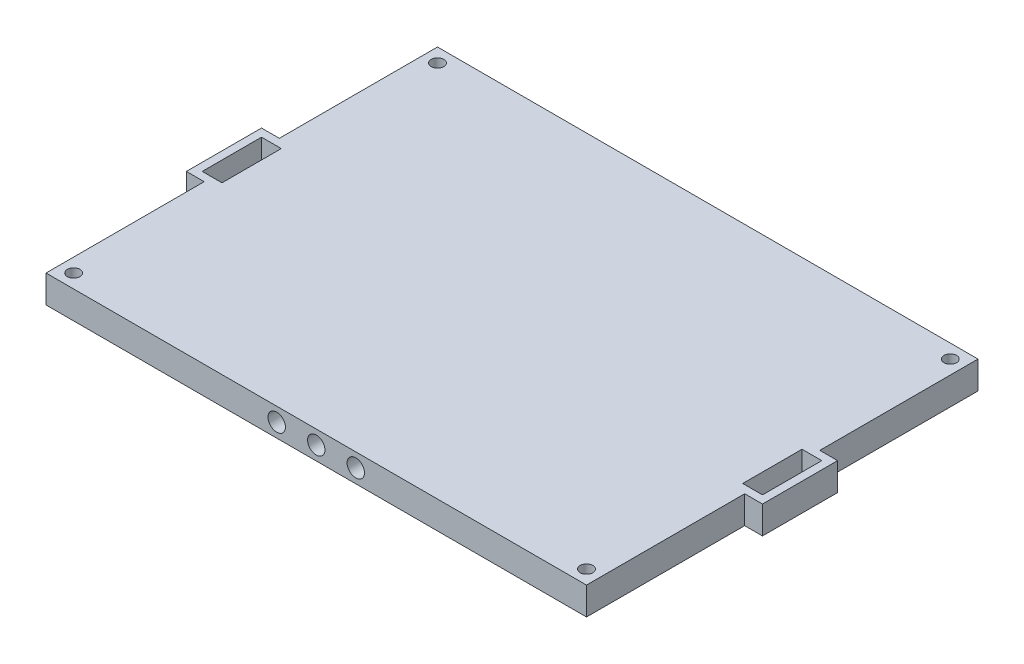
ISO-10303-21;
HEADER;
FILE_DESCRIPTION(('STEP AP214'),'2;1');
FILE_NAME('part.step','',(''),(''),'','','');
FILE_SCHEMA(('AUTOMOTIVE_DESIGN { 1 0 10303 214 1 1 1 1 }'));
ENDSEC;
DATA;
#1=APPLICATION_CONTEXT('core data for automotive mechanical design processes');
#2=APPLICATION_PROTOCOL_DEFINITION('international standard','automotive_design',2000,#1);
#3=PRODUCT_CONTEXT('',#1,'mechanical');
#4=PRODUCT('Part','Part','',(#3));
#5=PRODUCT_RELATED_PRODUCT_CATEGORY('part','',(#4));
#6=PRODUCT_DEFINITION_FORMATION('','',#4);
#7=PRODUCT_DEFINITION_CONTEXT('part definition',#1,'design');
#8=PRODUCT_DEFINITION('design','',#6,#7);
#9=PRODUCT_DEFINITION_SHAPE('','',#8);
#10=(LENGTH_UNIT() NAMED_UNIT(*) SI_UNIT(.MILLI.,.METRE.));
#11=(NAMED_UNIT(*) PLANE_ANGLE_UNIT() SI_UNIT($,.RADIAN.));
#12=(NAMED_UNIT(*) SI_UNIT($,.STERADIAN.) SOLID_ANGLE_UNIT());
#13=UNCERTAINTY_MEASURE_WITH_UNIT(LENGTH_MEASURE(1.E-05),#10,'distance_accuracy_value','');
#14=(GEOMETRIC_REPRESENTATION_CONTEXT(3) GLOBAL_UNCERTAINTY_ASSIGNED_CONTEXT((#13)) GLOBAL_UNIT_ASSIGNED_CONTEXT((#10,
#11,#12)) REPRESENTATION_CONTEXT('',''));
#15=CARTESIAN_POINT('',(0.,0.,0.));
#16=DIRECTION('',(0.,0.,1.));
#17=DIRECTION('',(1.,0.,0.));
#18=AXIS2_PLACEMENT_3D('',#15,#16,#17);
#19=CARTESIAN_POINT('',(0.,0.,0.));
#20=DIRECTION('',(0.,1.,0.));
#21=DIRECTION('',(0.,0.,1.));
#22=AXIS2_PLACEMENT_3D('',#19,#20,#21);
#23=PLANE('',#22);
#24=CARTESIAN_POINT('',(37.5,0.,-37.5));
#25=DIRECTION('',(0.,1.,0.));
#26=DIRECTION('',(0.,0.,1.));
#27=AXIS2_PLACEMENT_3D('',#24,#25,#26);
#28=CIRCLE('',#27,2.2);
#29=CARTESIAN_POINT('',(37.5,0.,-35.3));
#30=VERTEX_POINT('',#29);
#31=EDGE_CURVE('E526',#30,#30,#28,.F.);
#32=ORIENTED_EDGE('',*,*,#31,.F.);
#33=EDGE_LOOP('',(#32));
#34=FACE_BOUND('',#33,.T.);
#35=CARTESIAN_POINT('',(-37.5,0.,-37.5));
#36=DIRECTION('',(0.,1.,0.));
#37=DIRECTION('',(0.,0.,1.));
#38=AXIS2_PLACEMENT_3D('',#35,#36,#37);
#39=CIRCLE('',#38,2.2);
#40=CARTESIAN_POINT('',(-37.5,0.,-35.3));
#41=VERTEX_POINT('',#40);
#42=EDGE_CURVE('E525',#41,#41,#39,.T.);
#43=ORIENTED_EDGE('',*,*,#42,.T.);
#44=EDGE_LOOP('',(#43));
#45=FACE_BOUND('',#44,.T.);
#46=CARTESIAN_POINT('',(-64.8420173831868,0.,46.));
#47=DIRECTION('',(0.,1.,0.));
#48=DIRECTION('',(0.,0.,1.));
#49=AXIS2_PLACEMENT_3D('',#46,#47,#48);
#50=CIRCLE('',#49,1.60000000000001);
#51=CARTESIAN_POINT('',(-64.8420173831868,0.,47.6));
#52=VERTEX_POINT('',#51);
#53=EDGE_CURVE('E546',#52,#52,#50,.F.);
#54=ORIENTED_EDGE('',*,*,#53,.F.);
#55=EDGE_LOOP('',(#54));
#56=FACE_BOUND('',#55,.T.);
#57=CARTESIAN_POINT('',(-64.8420173831868,0.,-46.));
#58=DIRECTION('',(0.,1.,0.));
#59=DIRECTION('',(0.,0.,1.));
#60=AXIS2_PLACEMENT_3D('',#57,#58,#59);
#61=CIRCLE('',#60,1.60000000000001);
#62=CARTESIAN_POINT('',(-64.8420173831868,0.,-44.4));
#63=VERTEX_POINT('',#62);
#64=EDGE_CURVE('E312',#63,#63,#61,.T.);
#65=ORIENTED_EDGE('',*,*,#64,.T.);
#66=EDGE_LOOP('',(#65));
#67=FACE_BOUND('',#66,.T.);
#68=DIRECTION('',(1.,0.,0.));
#69=VECTOR('',#68,1.);
#70=CARTESIAN_POINT('',(0.,0.,7.5));
#71=LINE('',#70,#69);
#72=CARTESIAN_POINT('',(-70.8420173831867,0.,7.5));
#73=VERTEX_POINT('',#72);
#74=CARTESIAN_POINT('',(-65.8420173831867,0.,7.5));
#75=VERTEX_POINT('',#74);
#76=EDGE_CURVE('E305',#73,#75,#71,.T.);
#77=ORIENTED_EDGE('',*,*,#76,.T.);
#78=DIRECTION('',(0.,0.,-1.));
#79=VECTOR('',#78,1.);
#80=CARTESIAN_POINT('',(-65.8420173831867,0.,0.));
#81=LINE('',#80,#79);
#82=CARTESIAN_POINT('',(-65.8420173831867,0.,-7.5));
#83=VERTEX_POINT('',#82);
#84=EDGE_CURVE('E317',#75,#83,#81,.T.);
#85=ORIENTED_EDGE('',*,*,#84,.T.);
#86=DIRECTION('',(1.,0.,0.));
#87=VECTOR('',#86,1.);
#88=CARTESIAN_POINT('',(0.,0.,-7.5));
#89=LINE('',#88,#87);
#90=CARTESIAN_POINT('',(-70.8420173831867,0.,-7.5));
#91=VERTEX_POINT('',#90);
#92=EDGE_CURVE('E307',#91,#83,#89,.T.);
#93=ORIENTED_EDGE('',*,*,#92,.F.);
#94=DIRECTION('',(0.,0.,-1.));
#95=VECTOR('',#94,1.);
#96=CARTESIAN_POINT('',(-70.8420173831867,0.,0.));
#97=LINE('',#96,#95);
#98=EDGE_CURVE('E298',#73,#91,#97,.T.);
#99=ORIENTED_EDGE('',*,*,#98,.F.);
#100=EDGE_LOOP('',(#77,#85,#93,#99));
#101=FACE_BOUND('',#100,.T.);
#102=DIRECTION('',(0.,0.,-1.));
#103=VECTOR('',#102,1.);
#104=CARTESIAN_POINT('',(70.8420173831868,0.,0.));
#105=LINE('',#104,#103);
#106=CARTESIAN_POINT('',(70.8420173831868,0.,7.5));
#107=VERTEX_POINT('',#106);
#108=CARTESIAN_POINT('',(70.8420173831868,0.,-7.5));
#109=VERTEX_POINT('',#108);
#110=EDGE_CURVE('E319',#107,#109,#105,.T.);
#111=ORIENTED_EDGE('',*,*,#110,.T.);
#112=DIRECTION('',(-1.,0.,0.));
#113=VECTOR('',#112,1.);
#114=CARTESIAN_POINT('',(0.,0.,-7.5));
#115=LINE('',#114,#113);
#116=CARTESIAN_POINT('',(65.8420173831868,0.,-7.5));
#117=VERTEX_POINT('',#116);
#118=EDGE_CURVE('E328',#109,#117,#115,.T.);
#119=ORIENTED_EDGE('',*,*,#118,.T.);
#120=DIRECTION('',(0.,0.,-1.));
#121=VECTOR('',#120,1.);
#122=CARTESIAN_POINT('',(65.8420173831868,0.,0.));
#123=LINE('',#122,#121);
#124=CARTESIAN_POINT('',(65.8420173831868,0.,7.5));
#125=VERTEX_POINT('',#124);
#126=EDGE_CURVE('E325',#125,#117,#123,.T.);
#127=ORIENTED_EDGE('',*,*,#126,.F.);
#128=DIRECTION('',(-1.,0.,0.));
#129=VECTOR('',#128,1.);
#130=CARTESIAN_POINT('',(0.,0.,7.5));
#131=LINE('',#130,#129);
#132=EDGE_CURVE('E322',#107,#125,#131,.T.);
#133=ORIENTED_EDGE('',*,*,#132,.F.);
#134=EDGE_LOOP('',(#111,#119,#127,#133));
#135=FACE_BOUND('',#134,.T.);
#136=DIRECTION('',(0.,0.,-1.));
#137=VECTOR('',#136,1.);
#138=CARTESIAN_POINT('',(-68.3420173831867,0.,0.));
#139=LINE('',#138,#137);
#140=CARTESIAN_POINT('',(-68.3420173831867,0.,-9.5));
#141=VERTEX_POINT('',#140);
#142=CARTESIAN_POINT('',(-68.3420173831867,0.,-49.5));
#143=VERTEX_POINT('',#142);
#144=EDGE_CURVE('E331',#141,#143,#139,.T.);
#145=ORIENTED_EDGE('',*,*,#144,.T.);
#146=DIRECTION('',(1.,0.,0.));
#147=VECTOR('',#146,1.);
#148=CARTESIAN_POINT('',(0.,0.,-49.5));
#149=LINE('',#148,#147);
#150=CARTESIAN_POINT('',(68.3420173831868,0.,-49.5));
#151=VERTEX_POINT('',#150);
#152=EDGE_CURVE('E357',#143,#151,#149,.T.);
#153=ORIENTED_EDGE('',*,*,#152,.T.);
#154=DIRECTION('',(0.,0.,-1.));
#155=VECTOR('',#154,1.);
#156=CARTESIAN_POINT('',(68.3420173831868,0.,0.));
#157=LINE('',#156,#155);
#158=CARTESIAN_POINT('',(68.3420173831868,0.,-9.5));
#159=VERTEX_POINT('',#158);
#160=EDGE_CURVE('E350',#159,#151,#157,.T.);
#161=ORIENTED_EDGE('',*,*,#160,.F.);
#162=DIRECTION('',(-1.,0.,0.));
#163=VECTOR('',#162,1.);
#164=CARTESIAN_POINT('',(0.,0.,-9.50000000000001));
#165=LINE('',#164,#163);
#166=CARTESIAN_POINT('',(72.8420173831868,0.,-9.5));
#167=VERTEX_POINT('',#166);
#168=EDGE_CURVE('E255',#167,#159,#165,.T.);
#169=ORIENTED_EDGE('',*,*,#168,.F.);
#170=DIRECTION('',(0.,0.,-1.));
#171=VECTOR('',#170,1.);
#172=CARTESIAN_POINT('',(72.8420173831868,0.,0.));
#173=LINE('',#172,#171);
#174=CARTESIAN_POINT('',(72.8420173831868,0.,9.5));
#175=VERTEX_POINT('',#174);
#176=EDGE_CURVE('E353',#175,#167,#173,.T.);
#177=ORIENTED_EDGE('',*,*,#176,.F.);
#178=DIRECTION('',(-1.,0.,0.));
#179=VECTOR('',#178,1.);
#180=CARTESIAN_POINT('',(0.,0.,9.5));
#181=LINE('',#180,#179);
#182=CARTESIAN_POINT('',(68.3420173831868,0.,9.5));
#183=VERTEX_POINT('',#182);
#184=EDGE_CURVE('E349',#175,#183,#181,.T.);
#185=ORIENTED_EDGE('',*,*,#184,.T.);
#186=CARTESIAN_POINT('',(68.3420173831868,0.,49.5));
#187=VERTEX_POINT('',#186);
#188=EDGE_CURVE('E346',#187,#183,#157,.T.);
#189=ORIENTED_EDGE('',*,*,#188,.F.);
#190=DIRECTION('',(1.,0.,0.));
#191=VECTOR('',#190,1.);
#192=CARTESIAN_POINT('',(0.,0.,49.5));
#193=LINE('',#192,#191);
#194=CARTESIAN_POINT('',(-68.3420173831867,0.,49.5));
#195=VERTEX_POINT('',#194);
#196=EDGE_CURVE('E343',#195,#187,#193,.T.);
#197=ORIENTED_EDGE('',*,*,#196,.F.);
#198=CARTESIAN_POINT('',(-68.3420173831867,0.,9.5));
#199=VERTEX_POINT('',#198);
#200=EDGE_CURVE('E334',#195,#199,#139,.T.);
#201=ORIENTED_EDGE('',*,*,#200,.T.);
#202=DIRECTION('',(1.,0.,0.));
#203=VECTOR('',#202,1.);
#204=CARTESIAN_POINT('',(0.,0.,9.5));
#205=LINE('',#204,#203);
#206=CARTESIAN_POINT('',(-72.8420173831867,0.,9.5));
#207=VERTEX_POINT('',#206);
#208=EDGE_CURVE('E340',#207,#199,#205,.T.);
#209=ORIENTED_EDGE('',*,*,#208,.F.);
#210=DIRECTION('',(0.,0.,-1.));
#211=VECTOR('',#210,1.);
#212=CARTESIAN_POINT('',(-72.8420173831867,0.,0.));
#213=LINE('',#212,#211);
#214=CARTESIAN_POINT('',(-72.8420173831867,0.,-9.5));
#215=VERTEX_POINT('',#214);
#216=EDGE_CURVE('E337',#207,#215,#213,.T.);
#217=ORIENTED_EDGE('',*,*,#216,.T.);
#218=DIRECTION('',(1.,0.,0.));
#219=VECTOR('',#218,1.);
#220=CARTESIAN_POINT('',(0.,0.,-9.50000000000001));
#221=LINE('',#220,#219);
#222=EDGE_CURVE('E333',#215,#141,#221,.T.);
#223=ORIENTED_EDGE('',*,*,#222,.T.);
#224=EDGE_LOOP('',(#145,#153,#161,#169,#177,#185,#189,#197,#201,#209,#217,#223));
#225=FACE_BOUND('',#224,.T.);
#226=CARTESIAN_POINT('',(64.8420173831868,0.,46.));
#227=DIRECTION('',(0.,1.,0.));
#228=DIRECTION('',(0.,0.,1.));
#229=AXIS2_PLACEMENT_3D('',#226,#227,#228);
#230=CIRCLE('',#229,1.60000000000001);
#231=CARTESIAN_POINT('',(64.8420173831868,0.,47.6));
#232=VERTEX_POINT('',#231);
#233=EDGE_CURVE('E553',#232,#232,#230,.T.);
#234=ORIENTED_EDGE('',*,*,#233,.T.);
#235=EDGE_LOOP('',(#234));
#236=FACE_BOUND('',#235,.T.);
#237=CARTESIAN_POINT('',(64.8420173831868,0.,-46.));
#238=DIRECTION('',(0.,1.,0.));
#239=DIRECTION('',(0.,0.,1.));
#240=AXIS2_PLACEMENT_3D('',#237,#238,#239);
#241=CIRCLE('',#240,1.60000000000001);
#242=CARTESIAN_POINT('',(64.8420173831868,0.,-44.4));
#243=VERTEX_POINT('',#242);
#244=EDGE_CURVE('E556',#243,#243,#241,.F.);
#245=ORIENTED_EDGE('',*,*,#244,.F.);
#246=EDGE_LOOP('',(#245));
#247=FACE_BOUND('',#246,.T.);
#248=CARTESIAN_POINT('',(37.5,0.,37.5));
#249=DIRECTION('',(0.,1.,0.));
#250=DIRECTION('',(0.,0.,1.));
#251=AXIS2_PLACEMENT_3D('',#248,#249,#250);
#252=CIRCLE('',#251,2.2);
#253=CARTESIAN_POINT('',(37.5,0.,39.7));
#254=VERTEX_POINT('',#253);
#255=EDGE_CURVE('E532',#254,#254,#252,.T.);
#256=ORIENTED_EDGE('',*,*,#255,.T.);
#257=EDGE_LOOP('',(#256));
#258=FACE_BOUND('',#257,.T.);
#259=CARTESIAN_POINT('',(-37.5,0.,37.5));
#260=DIRECTION('',(0.,1.,0.));
#261=DIRECTION('',(0.,0.,1.));
#262=AXIS2_PLACEMENT_3D('',#259,#260,#261);
#263=CIRCLE('',#262,2.2);
#264=CARTESIAN_POINT('',(-37.5,0.,39.7));
#265=VERTEX_POINT('',#264);
#266=EDGE_CURVE('E520',#265,#265,#263,.F.);
#267=ORIENTED_EDGE('',*,*,#266,.F.);
#268=EDGE_LOOP('',(#267));
#269=FACE_BOUND('',#268,.T.);
#270=ADVANCED_FACE('F87',(#34,#45,#56,#67,#101,#135,#225,#236,#247,#258,#269),#23,.F.);
#271=CARTESIAN_POINT('',(0.,7.,0.));
#272=DIRECTION('',(0.,1.,0.));
#273=DIRECTION('',(0.,0.,1.));
#274=AXIS2_PLACEMENT_3D('',#271,#272,#273);
#275=PLANE('',#274);
#276=CARTESIAN_POINT('',(64.8420173831868,7.,46.));
#277=DIRECTION('',(0.,1.,0.));
#278=DIRECTION('',(0.,0.,1.));
#279=AXIS2_PLACEMENT_3D('',#276,#277,#278);
#280=CIRCLE('',#279,1.60000000000001);
#281=CARTESIAN_POINT('',(64.8420173831868,7.,47.6));
#282=VERTEX_POINT('',#281);
#283=EDGE_CURVE('E552',#282,#282,#280,.T.);
#284=ORIENTED_EDGE('',*,*,#283,.F.);
#285=EDGE_LOOP('',(#284));
#286=FACE_BOUND('',#285,.T.);
#287=CARTESIAN_POINT('',(-64.8420173831868,7.,-46.));
#288=DIRECTION('',(0.,1.,0.));
#289=DIRECTION('',(0.,0.,1.));
#290=AXIS2_PLACEMENT_3D('',#287,#288,#289);
#291=CIRCLE('',#290,1.60000000000001);
#292=CARTESIAN_POINT('',(-64.8420173831868,7.,-44.4));
#293=VERTEX_POINT('',#292);
#294=EDGE_CURVE('E309',#293,#293,#291,.T.);
#295=ORIENTED_EDGE('',*,*,#294,.F.);
#296=EDGE_LOOP('',(#295));
#297=FACE_BOUND('',#296,.T.);
#298=DIRECTION('',(1.,0.,0.));
#299=VECTOR('',#298,1.);
#300=CARTESIAN_POINT('',(0.,7.,7.5));
#301=LINE('',#300,#299);
#302=CARTESIAN_POINT('',(-70.8420173831867,7.,7.5));
#303=VERTEX_POINT('',#302);
#304=CARTESIAN_POINT('',(-65.8420173831867,7.,7.5));
#305=VERTEX_POINT('',#304);
#306=EDGE_CURVE('E359',#303,#305,#301,.T.);
#307=ORIENTED_EDGE('',*,*,#306,.F.);
#308=DIRECTION('',(0.,0.,-1.));
#309=VECTOR('',#308,1.);
#310=CARTESIAN_POINT('',(-70.8420173831867,7.,0.));
#311=LINE('',#310,#309);
#312=CARTESIAN_POINT('',(-70.8420173831867,7.,-7.5));
#313=VERTEX_POINT('',#312);
#314=EDGE_CURVE('E299',#303,#313,#311,.T.);
#315=ORIENTED_EDGE('',*,*,#314,.T.);
#316=DIRECTION('',(1.,0.,0.));
#317=VECTOR('',#316,1.);
#318=CARTESIAN_POINT('',(0.,7.,-7.5));
#319=LINE('',#318,#317);
#320=CARTESIAN_POINT('',(-65.8420173831867,7.,-7.5));
#321=VERTEX_POINT('',#320);
#322=EDGE_CURVE('E566',#313,#321,#319,.T.);
#323=ORIENTED_EDGE('',*,*,#322,.T.);
#324=DIRECTION('',(0.,0.,-1.));
#325=VECTOR('',#324,1.);
#326=CARTESIAN_POINT('',(-65.8420173831867,7.,0.));
#327=LINE('',#326,#325);
#328=EDGE_CURVE('E568',#305,#321,#327,.T.);
#329=ORIENTED_EDGE('',*,*,#328,.F.);
#330=EDGE_LOOP('',(#307,#315,#323,#329));
#331=FACE_BOUND('',#330,.T.);
#332=DIRECTION('',(0.,0.,-1.));
#333=VECTOR('',#332,1.);
#334=CARTESIAN_POINT('',(70.8420173831868,7.,0.));
#335=LINE('',#334,#333);
#336=CARTESIAN_POINT('',(70.8420173831868,7.,7.5));
#337=VERTEX_POINT('',#336);
#338=CARTESIAN_POINT('',(70.8420173831868,7.,-7.5));
#339=VERTEX_POINT('',#338);
#340=EDGE_CURVE('E571',#337,#339,#335,.T.);
#341=ORIENTED_EDGE('',*,*,#340,.F.);
#342=DIRECTION('',(-1.,0.,0.));
#343=VECTOR('',#342,1.);
#344=CARTESIAN_POINT('',(0.,7.,7.5));
#345=LINE('',#344,#343);
#346=CARTESIAN_POINT('',(65.8420173831868,7.,7.5));
#347=VERTEX_POINT('',#346);
#348=EDGE_CURVE('E574',#337,#347,#345,.T.);
#349=ORIENTED_EDGE('',*,*,#348,.T.);
#350=DIRECTION('',(0.,0.,-1.));
#351=VECTOR('',#350,1.);
#352=CARTESIAN_POINT('',(65.8420173831868,7.,0.));
#353=LINE('',#352,#351);
#354=CARTESIAN_POINT('',(65.8420173831868,7.,-7.5));
#355=VERTEX_POINT('',#354);
#356=EDGE_CURVE('E577',#347,#355,#353,.T.);
#357=ORIENTED_EDGE('',*,*,#356,.T.);
#358=DIRECTION('',(-1.,0.,0.));
#359=VECTOR('',#358,1.);
#360=CARTESIAN_POINT('',(0.,7.,-7.5));
#361=LINE('',#360,#359);
#362=EDGE_CURVE('E579',#339,#355,#361,.T.);
#363=ORIENTED_EDGE('',*,*,#362,.F.);
#364=EDGE_LOOP('',(#341,#349,#357,#363));
#365=FACE_BOUND('',#364,.T.);
#366=DIRECTION('',(0.,0.,-1.));
#367=VECTOR('',#366,1.);
#368=CARTESIAN_POINT('',(-68.3420173831867,7.,0.));
#369=LINE('',#368,#367);
#370=CARTESIAN_POINT('',(-68.3420173831867,7.,-9.5));
#371=VERTEX_POINT('',#370);
#372=CARTESIAN_POINT('',(-68.3420173831867,7.,-49.5));
#373=VERTEX_POINT('',#372);
#374=EDGE_CURVE('E582',#371,#373,#369,.T.);
#375=ORIENTED_EDGE('',*,*,#374,.F.);
#376=DIRECTION('',(1.,0.,0.));
#377=VECTOR('',#376,1.);
#378=CARTESIAN_POINT('',(0.,7.,-9.50000000000001));
#379=LINE('',#378,#377);
#380=CARTESIAN_POINT('',(-72.8420173831867,7.,-9.5));
#381=VERTEX_POINT('',#380);
#382=EDGE_CURVE('E584',#381,#371,#379,.T.);
#383=ORIENTED_EDGE('',*,*,#382,.F.);
#384=DIRECTION('',(0.,0.,-1.));
#385=VECTOR('',#384,1.);
#386=CARTESIAN_POINT('',(-72.8420173831867,7.,0.));
#387=LINE('',#386,#385);
#388=CARTESIAN_POINT('',(-72.8420173831867,7.,9.5));
#389=VERTEX_POINT('',#388);
#390=EDGE_CURVE('E398',#389,#381,#387,.T.);
#391=ORIENTED_EDGE('',*,*,#390,.F.);
#392=DIRECTION('',(1.,0.,0.));
#393=VECTOR('',#392,1.);
#394=CARTESIAN_POINT('',(0.,7.,9.5));
#395=LINE('',#394,#393);
#396=CARTESIAN_POINT('',(-68.3420173831867,7.,9.5));
#397=VERTEX_POINT('',#396);
#398=EDGE_CURVE('E587',#389,#397,#395,.T.);
#399=ORIENTED_EDGE('',*,*,#398,.T.);
#400=CARTESIAN_POINT('',(-68.3420173831867,7.,49.5));
#401=VERTEX_POINT('',#400);
#402=EDGE_CURVE('E387',#401,#397,#369,.T.);
#403=ORIENTED_EDGE('',*,*,#402,.F.);
#404=DIRECTION('',(1.,0.,0.));
#405=VECTOR('',#404,1.);
#406=CARTESIAN_POINT('',(0.,7.,49.5));
#407=LINE('',#406,#405);
#408=CARTESIAN_POINT('',(68.3420173831868,7.,49.5));
#409=VERTEX_POINT('',#408);
#410=EDGE_CURVE('E382',#401,#409,#407,.T.);
#411=ORIENTED_EDGE('',*,*,#410,.T.);
#412=DIRECTION('',(0.,0.,-1.));
#413=VECTOR('',#412,1.);
#414=CARTESIAN_POINT('',(68.3420173831868,7.,0.));
#415=LINE('',#414,#413);
#416=CARTESIAN_POINT('',(68.3420173831868,7.,9.5));
#417=VERTEX_POINT('',#416);
#418=EDGE_CURVE('E242',#409,#417,#415,.T.);
#419=ORIENTED_EDGE('',*,*,#418,.T.);
#420=DIRECTION('',(-1.,0.,0.));
#421=VECTOR('',#420,1.);
#422=CARTESIAN_POINT('',(0.,7.,9.5));
#423=LINE('',#422,#421);
#424=CARTESIAN_POINT('',(72.8420173831868,7.,9.5));
#425=VERTEX_POINT('',#424);
#426=EDGE_CURVE('E370',#425,#417,#423,.T.);
#427=ORIENTED_EDGE('',*,*,#426,.F.);
#428=DIRECTION('',(0.,0.,-1.));
#429=VECTOR('',#428,1.);
#430=CARTESIAN_POINT('',(72.8420173831868,7.,0.));
#431=LINE('',#430,#429);
#432=CARTESIAN_POINT('',(72.8420173831868,7.,-9.5));
#433=VERTEX_POINT('',#432);
#434=EDGE_CURVE('E249',#425,#433,#431,.T.);
#435=ORIENTED_EDGE('',*,*,#434,.T.);
#436=DIRECTION('',(-1.,0.,0.));
#437=VECTOR('',#436,1.);
#438=CARTESIAN_POINT('',(0.,7.,-9.50000000000001));
#439=LINE('',#438,#437);
#440=CARTESIAN_POINT('',(68.3420173831868,7.,-9.5));
#441=VERTEX_POINT('',#440);
#442=EDGE_CURVE('E240',#433,#441,#439,.T.);
#443=ORIENTED_EDGE('',*,*,#442,.T.);
#444=CARTESIAN_POINT('',(68.3420173831868,7.,-49.5));
#445=VERTEX_POINT('',#444);
#446=EDGE_CURVE('E231',#441,#445,#415,.T.);
#447=ORIENTED_EDGE('',*,*,#446,.T.);
#448=DIRECTION('',(1.,0.,0.));
#449=VECTOR('',#448,1.);
#450=CARTESIAN_POINT('',(0.,7.,-49.5));
#451=LINE('',#450,#449);
#452=EDGE_CURVE('E239',#373,#445,#451,.T.);
#453=ORIENTED_EDGE('',*,*,#452,.F.);
#454=EDGE_LOOP('',(#375,#383,#391,#399,#403,#411,#419,#427,#435,#443,#447,#453));
#455=FACE_BOUND('',#454,.T.);
#456=CARTESIAN_POINT('',(-64.8420173831868,7.,46.));
#457=DIRECTION('',(0.,1.,0.));
#458=DIRECTION('',(0.,0.,1.));
#459=AXIS2_PLACEMENT_3D('',#456,#457,#458);
#460=CIRCLE('',#459,1.60000000000001);
#461=CARTESIAN_POINT('',(-64.8420173831868,7.,47.6));
#462=VERTEX_POINT('',#461);
#463=EDGE_CURVE('E549',#462,#462,#460,.F.);
#464=ORIENTED_EDGE('',*,*,#463,.T.);
#465=EDGE_LOOP('',(#464));
#466=FACE_BOUND('',#465,.T.);
#467=CARTESIAN_POINT('',(64.8420173831868,7.,-46.));
#468=DIRECTION('',(0.,1.,0.));
#469=DIRECTION('',(0.,0.,1.));
#470=AXIS2_PLACEMENT_3D('',#467,#468,#469);
#471=CIRCLE('',#470,1.60000000000001);
#472=CARTESIAN_POINT('',(64.8420173831868,7.,-44.4));
#473=VERTEX_POINT('',#472);
#474=EDGE_CURVE('E543',#473,#473,#471,.F.);
#475=ORIENTED_EDGE('',*,*,#474,.T.);
#476=EDGE_LOOP('',(#475));
#477=FACE_BOUND('',#476,.T.);
#478=ADVANCED_FACE('F245',(#286,#297,#331,#365,#455,#466,#477),#275,.T.);
#479=CARTESIAN_POINT('',(0.,7.,-9.50000000000001));
#480=DIRECTION('',(0.,0.,-1.));
#481=DIRECTION('',(-1.,0.,0.));
#482=AXIS2_PLACEMENT_3D('',#479,#480,#481);
#483=PLANE('',#482);
#484=ORIENTED_EDGE('',*,*,#222,.F.);
#485=DIRECTION('',(0.,-1.,0.));
#486=VECTOR('',#485,1.);
#487=CARTESIAN_POINT('',(-72.8420173831867,7.,-9.5));
#488=LINE('',#487,#486);
#489=EDGE_CURVE('E97',#381,#215,#488,.T.);
#490=ORIENTED_EDGE('',*,*,#489,.F.);
#491=ORIENTED_EDGE('',*,*,#382,.T.);
#492=DIRECTION('',(0.,-1.,0.));
#493=VECTOR('',#492,1.);
#494=CARTESIAN_POINT('',(-68.3420173831867,7.,-9.5));
#495=LINE('',#494,#493);
#496=EDGE_CURVE('E12',#371,#141,#495,.T.);
#497=ORIENTED_EDGE('',*,*,#496,.T.);
#498=EDGE_LOOP('',(#484,#490,#491,#497));
#499=FACE_BOUND('',#498,.T.);
#500=ADVANCED_FACE('F402',(#499),#483,.T.);
#501=CARTESIAN_POINT('',(-72.8420173831867,7.,0.));
#502=DIRECTION('',(-1.,0.,0.));
#503=DIRECTION('',(0.,0.,1.));
#504=AXIS2_PLACEMENT_3D('',#501,#502,#503);
#505=PLANE('',#504);
#506=ORIENTED_EDGE('',*,*,#216,.F.);
#507=DIRECTION('',(0.,-1.,0.));
#508=VECTOR('',#507,1.);
#509=CARTESIAN_POINT('',(-72.8420173831867,7.,9.5));
#510=LINE('',#509,#508);
#511=EDGE_CURVE('E273',#389,#207,#510,.T.);
#512=ORIENTED_EDGE('',*,*,#511,.F.);
#513=ORIENTED_EDGE('',*,*,#390,.T.);
#514=ORIENTED_EDGE('',*,*,#489,.T.);
#515=EDGE_LOOP('',(#506,#512,#513,#514));
#516=FACE_BOUND('',#515,.T.);
#517=ADVANCED_FACE('F393',(#516),#505,.T.);
#518=CARTESIAN_POINT('',(0.,7.,9.5));
#519=DIRECTION('',(0.,0.,-1.));
#520=DIRECTION('',(-1.,0.,0.));
#521=AXIS2_PLACEMENT_3D('',#518,#519,#520);
#522=PLANE('',#521);
#523=ORIENTED_EDGE('',*,*,#208,.T.);
#524=DIRECTION('',(0.,-1.,0.));
#525=VECTOR('',#524,1.);
#526=CARTESIAN_POINT('',(-68.3420173831867,7.,9.5));
#527=LINE('',#526,#525);
#528=EDGE_CURVE('E271',#397,#199,#527,.T.);
#529=ORIENTED_EDGE('',*,*,#528,.F.);
#530=ORIENTED_EDGE('',*,*,#398,.F.);
#531=ORIENTED_EDGE('',*,*,#511,.T.);
#532=EDGE_LOOP('',(#523,#529,#530,#531));
#533=FACE_BOUND('',#532,.T.);
#534=ADVANCED_FACE('F591',(#533),#522,.F.);
#535=CARTESIAN_POINT('',(-68.3420173831867,7.,0.));
#536=DIRECTION('',(-1.,0.,0.));
#537=DIRECTION('',(0.,0.,1.));
#538=AXIS2_PLACEMENT_3D('',#535,#536,#537);
#539=PLANE('',#538);
#540=ORIENTED_EDGE('',*,*,#200,.F.);
#541=DIRECTION('',(0.,-1.,0.));
#542=VECTOR('',#541,1.);
#543=CARTESIAN_POINT('',(-68.3420173831867,7.,49.5));
#544=LINE('',#543,#542);
#545=EDGE_CURVE('E269',#401,#195,#544,.T.);
#546=ORIENTED_EDGE('',*,*,#545,.F.);
#547=ORIENTED_EDGE('',*,*,#402,.T.);
#548=ORIENTED_EDGE('',*,*,#528,.T.);
#549=EDGE_LOOP('',(#540,#546,#547,#548));
#550=FACE_BOUND('',#549,.T.);
#551=ADVANCED_FACE('F386',(#550),#539,.T.);
#552=CARTESIAN_POINT('',(0.,7.,49.5));
#553=DIRECTION('',(0.,0.,-1.));
#554=DIRECTION('',(-1.,0.,0.));
#555=AXIS2_PLACEMENT_3D('',#552,#553,#554);
#556=PLANE('',#555);
#557=CARTESIAN_POINT('',(-10.,3.49999999999985,49.5));
#558=DIRECTION('',(0.,0.,1.));
#559=DIRECTION('',(-1.,0.,0.));
#560=AXIS2_PLACEMENT_3D('',#557,#558,#559);
#561=CIRCLE('',#560,2.2);
#562=CARTESIAN_POINT('',(-12.2,3.49999999999985,49.5));
#563=VERTEX_POINT('',#562);
#564=EDGE_CURVE('E511',#563,#563,#561,.T.);
#565=ORIENTED_EDGE('',*,*,#564,.F.);
#566=EDGE_LOOP('',(#565));
#567=FACE_BOUND('',#566,.T.);
#568=CARTESIAN_POINT('',(10.,3.5,49.5));
#569=DIRECTION('',(0.,0.,1.));
#570=DIRECTION('',(1.,0.,0.));
#571=AXIS2_PLACEMENT_3D('',#568,#569,#570);
#572=CIRCLE('',#571,2.2);
#573=CARTESIAN_POINT('',(12.2,3.5,49.5));
#574=VERTEX_POINT('',#573);
#575=EDGE_CURVE('E504',#574,#574,#572,.T.);
#576=ORIENTED_EDGE('',*,*,#575,.F.);
#577=EDGE_LOOP('',(#576));
#578=FACE_BOUND('',#577,.T.);
#579=CARTESIAN_POINT('',(0.,3.5,49.5));
#580=DIRECTION('',(0.,0.,1.));
#581=DIRECTION('',(1.,0.,0.));
#582=AXIS2_PLACEMENT_3D('',#579,#580,#581);
#583=CIRCLE('',#582,2.2);
#584=CARTESIAN_POINT('',(2.2,3.5,49.5));
#585=VERTEX_POINT('',#584);
#586=EDGE_CURVE('E506',#585,#585,#583,.T.);
#587=ORIENTED_EDGE('',*,*,#586,.F.);
#588=EDGE_LOOP('',(#587));
#589=FACE_BOUND('',#588,.T.);
#590=ORIENTED_EDGE('',*,*,#196,.T.);
#591=DIRECTION('',(0.,-1.,0.));
#592=VECTOR('',#591,1.);
#593=CARTESIAN_POINT('',(68.3420173831868,7.,49.5));
#594=LINE('',#593,#592);
#595=EDGE_CURVE('E266',#409,#187,#594,.T.);
#596=ORIENTED_EDGE('',*,*,#595,.F.);
#597=ORIENTED_EDGE('',*,*,#410,.F.);
#598=ORIENTED_EDGE('',*,*,#545,.T.);
#599=EDGE_LOOP('',(#590,#596,#597,#598));
#600=FACE_BOUND('',#599,.T.);
#601=ADVANCED_FACE('F381',(#567,#578,#589,#600),#556,.F.);
#602=CARTESIAN_POINT('',(68.3420173831868,7.,0.));
#603=DIRECTION('',(-1.,0.,0.));
#604=DIRECTION('',(0.,0.,1.));
#605=AXIS2_PLACEMENT_3D('',#602,#603,#604);
#606=PLANE('',#605);
#607=ORIENTED_EDGE('',*,*,#188,.T.);
#608=DIRECTION('',(0.,-1.,0.));
#609=VECTOR('',#608,1.);
#610=CARTESIAN_POINT('',(68.3420173831868,7.,9.5));
#611=LINE('',#610,#609);
#612=EDGE_CURVE('E264',#417,#183,#611,.T.);
#613=ORIENTED_EDGE('',*,*,#612,.F.);
#614=ORIENTED_EDGE('',*,*,#418,.F.);
#615=ORIENTED_EDGE('',*,*,#595,.T.);
#616=EDGE_LOOP('',(#607,#613,#614,#615));
#617=FACE_BOUND('',#616,.T.);
#618=ADVANCED_FACE('F377',(#617),#606,.F.);
#619=CARTESIAN_POINT('',(0.,7.,9.5));
#620=DIRECTION('',(0.,0.,1.));
#621=DIRECTION('',(1.,0.,0.));
#622=AXIS2_PLACEMENT_3D('',#619,#620,#621);
#623=PLANE('',#622);
#624=ORIENTED_EDGE('',*,*,#184,.F.);
#625=DIRECTION('',(0.,-1.,0.));
#626=VECTOR('',#625,1.);
#627=CARTESIAN_POINT('',(72.8420173831868,7.,9.5));
#628=LINE('',#627,#626);
#629=EDGE_CURVE('E258',#425,#175,#628,.T.);
#630=ORIENTED_EDGE('',*,*,#629,.F.);
#631=ORIENTED_EDGE('',*,*,#426,.T.);
#632=ORIENTED_EDGE('',*,*,#612,.T.);
#633=EDGE_LOOP('',(#624,#630,#631,#632));
#634=FACE_BOUND('',#633,.T.);
#635=ADVANCED_FACE('F369',(#634),#623,.T.);
#636=CARTESIAN_POINT('',(72.8420173831868,7.,0.));
#637=DIRECTION('',(-1.,0.,0.));
#638=DIRECTION('',(0.,0.,1.));
#639=AXIS2_PLACEMENT_3D('',#636,#637,#638);
#640=PLANE('',#639);
#641=ORIENTED_EDGE('',*,*,#176,.T.);
#642=DIRECTION('',(0.,-1.,0.));
#643=VECTOR('',#642,1.);
#644=CARTESIAN_POINT('',(72.8420173831868,7.,-9.5));
#645=LINE('',#644,#643);
#646=EDGE_CURVE('E256',#433,#167,#645,.T.);
#647=ORIENTED_EDGE('',*,*,#646,.F.);
#648=ORIENTED_EDGE('',*,*,#434,.F.);
#649=ORIENTED_EDGE('',*,*,#629,.T.);
#650=EDGE_LOOP('',(#641,#647,#648,#649));
#651=FACE_BOUND('',#650,.T.);
#652=ADVANCED_FACE('F366',(#651),#640,.F.);
#653=CARTESIAN_POINT('',(0.,7.,-9.50000000000001));
#654=DIRECTION('',(0.,0.,1.));
#655=DIRECTION('',(1.,0.,0.));
#656=AXIS2_PLACEMENT_3D('',#653,#654,#655);
#657=PLANE('',#656);
#658=ORIENTED_EDGE('',*,*,#168,.T.);
#659=DIRECTION('',(0.,-1.,0.));
#660=VECTOR('',#659,1.);
#661=CARTESIAN_POINT('',(68.3420173831868,7.,-9.5));
#662=LINE('',#661,#660);
#663=EDGE_CURVE('E235',#441,#159,#662,.T.);
#664=ORIENTED_EDGE('',*,*,#663,.F.);
#665=ORIENTED_EDGE('',*,*,#442,.F.);
#666=ORIENTED_EDGE('',*,*,#646,.T.);
#667=EDGE_LOOP('',(#658,#664,#665,#666));
#668=FACE_BOUND('',#667,.T.);
#669=ADVANCED_FACE('F254',(#668),#657,.F.);
#670=ORIENTED_EDGE('',*,*,#160,.T.);
#671=DIRECTION('',(0.,-1.,0.));
#672=VECTOR('',#671,1.);
#673=CARTESIAN_POINT('',(68.3420173831868,7.,-49.5));
#674=LINE('',#673,#672);
#675=EDGE_CURVE('E168',#445,#151,#674,.T.);
#676=ORIENTED_EDGE('',*,*,#675,.F.);
#677=ORIENTED_EDGE('',*,*,#446,.F.);
#678=ORIENTED_EDGE('',*,*,#663,.T.);
#679=EDGE_LOOP('',(#670,#676,#677,#678));
#680=FACE_BOUND('',#679,.T.);
#681=ADVANCED_FACE('F233',(#680),#606,.F.);
#682=CARTESIAN_POINT('',(0.,7.,-49.5));
#683=DIRECTION('',(0.,0.,-1.));
#684=DIRECTION('',(-1.,0.,0.));
#685=AXIS2_PLACEMENT_3D('',#682,#683,#684);
#686=PLANE('',#685);
#687=ORIENTED_EDGE('',*,*,#152,.F.);
#688=DIRECTION('',(0.,-1.,0.));
#689=VECTOR('',#688,1.);
#690=CARTESIAN_POINT('',(-68.3420173831867,7.,-49.5));
#691=LINE('',#690,#689);
#692=EDGE_CURVE('E106',#373,#143,#691,.T.);
#693=ORIENTED_EDGE('',*,*,#692,.F.);
#694=ORIENTED_EDGE('',*,*,#452,.T.);
#695=ORIENTED_EDGE('',*,*,#675,.T.);
#696=EDGE_LOOP('',(#687,#693,#694,#695));
#697=FACE_BOUND('',#696,.T.);
#698=ADVANCED_FACE('F403',(#697),#686,.T.);
#699=ORIENTED_EDGE('',*,*,#144,.F.);
#700=ORIENTED_EDGE('',*,*,#496,.F.);
#701=ORIENTED_EDGE('',*,*,#374,.T.);
#702=ORIENTED_EDGE('',*,*,#692,.T.);
#703=EDGE_LOOP('',(#699,#700,#701,#702));
#704=FACE_BOUND('',#703,.T.);
#705=ADVANCED_FACE('F405',(#704),#539,.T.);
#706=CARTESIAN_POINT('',(0.,7.,7.5));
#707=DIRECTION('',(0.,0.,1.));
#708=DIRECTION('',(1.,0.,0.));
#709=AXIS2_PLACEMENT_3D('',#706,#707,#708);
#710=PLANE('',#709);
#711=ORIENTED_EDGE('',*,*,#132,.T.);
#712=DIRECTION('',(0.,-1.,0.));
#713=VECTOR('',#712,1.);
#714=CARTESIAN_POINT('',(65.8420173831868,7.,7.5));
#715=LINE('',#714,#713);
#716=EDGE_CURVE('E280',#347,#125,#715,.T.);
#717=ORIENTED_EDGE('',*,*,#716,.F.);
#718=ORIENTED_EDGE('',*,*,#348,.F.);
#719=DIRECTION('',(0.,-1.,0.));
#720=VECTOR('',#719,1.);
#721=CARTESIAN_POINT('',(70.8420173831868,7.,7.5));
#722=LINE('',#721,#720);
#723=EDGE_CURVE('E283',#337,#107,#722,.T.);
#724=ORIENTED_EDGE('',*,*,#723,.T.);
#725=EDGE_LOOP('',(#711,#717,#718,#724));
#726=FACE_BOUND('',#725,.T.);
#727=ADVANCED_FACE('F411',(#726),#710,.F.);
#728=CARTESIAN_POINT('',(65.8420173831868,7.,0.));
#729=DIRECTION('',(-1.,0.,0.));
#730=DIRECTION('',(0.,0.,1.));
#731=AXIS2_PLACEMENT_3D('',#728,#729,#730);
#732=PLANE('',#731);
#733=ORIENTED_EDGE('',*,*,#126,.T.);
#734=DIRECTION('',(0.,-1.,0.));
#735=VECTOR('',#734,1.);
#736=CARTESIAN_POINT('',(65.8420173831868,7.,-7.5));
#737=LINE('',#736,#735);
#738=EDGE_CURVE('E278',#355,#117,#737,.T.);
#739=ORIENTED_EDGE('',*,*,#738,.F.);
#740=ORIENTED_EDGE('',*,*,#356,.F.);
#741=ORIENTED_EDGE('',*,*,#716,.T.);
#742=EDGE_LOOP('',(#733,#739,#740,#741));
#743=FACE_BOUND('',#742,.T.);
#744=ADVANCED_FACE('F607',(#743),#732,.F.);
#745=CARTESIAN_POINT('',(0.,7.,-7.5));
#746=DIRECTION('',(0.,0.,1.));
#747=DIRECTION('',(1.,0.,0.));
#748=AXIS2_PLACEMENT_3D('',#745,#746,#747);
#749=PLANE('',#748);
#750=ORIENTED_EDGE('',*,*,#118,.F.);
#751=DIRECTION('',(0.,-1.,0.));
#752=VECTOR('',#751,1.);
#753=CARTESIAN_POINT('',(70.8420173831868,7.,-7.5));
#754=LINE('',#753,#752);
#755=EDGE_CURVE('E276',#339,#109,#754,.T.);
#756=ORIENTED_EDGE('',*,*,#755,.F.);
#757=ORIENTED_EDGE('',*,*,#362,.T.);
#758=ORIENTED_EDGE('',*,*,#738,.T.);
#759=EDGE_LOOP('',(#750,#756,#757,#758));
#760=FACE_BOUND('',#759,.T.);
#761=ADVANCED_FACE('F603',(#760),#749,.T.);
#762=CARTESIAN_POINT('',(70.8420173831868,7.,0.));
#763=DIRECTION('',(-1.,0.,0.));
#764=DIRECTION('',(0.,0.,1.));
#765=AXIS2_PLACEMENT_3D('',#762,#763,#764);
#766=PLANE('',#765);
#767=ORIENTED_EDGE('',*,*,#110,.F.);
#768=ORIENTED_EDGE('',*,*,#723,.F.);
#769=ORIENTED_EDGE('',*,*,#340,.T.);
#770=ORIENTED_EDGE('',*,*,#755,.T.);
#771=EDGE_LOOP('',(#767,#768,#769,#770));
#772=FACE_BOUND('',#771,.T.);
#773=ADVANCED_FACE('F606',(#772),#766,.T.);
#774=CARTESIAN_POINT('',(-70.8420173831867,7.,0.));
#775=DIRECTION('',(-1.,0.,0.));
#776=DIRECTION('',(0.,0.,1.));
#777=AXIS2_PLACEMENT_3D('',#774,#775,#776);
#778=PLANE('',#777);
#779=ORIENTED_EDGE('',*,*,#98,.T.);
#780=DIRECTION('',(0.,-1.,0.));
#781=VECTOR('',#780,1.);
#782=CARTESIAN_POINT('',(-70.8420173831867,7.,-7.5));
#783=LINE('',#782,#781);
#784=EDGE_CURVE('E288',#313,#91,#783,.T.);
#785=ORIENTED_EDGE('',*,*,#784,.F.);
#786=ORIENTED_EDGE('',*,*,#314,.F.);
#787=DIRECTION('',(0.,-1.,0.));
#788=VECTOR('',#787,1.);
#789=CARTESIAN_POINT('',(-70.8420173831867,7.,7.5));
#790=LINE('',#789,#788);
#791=EDGE_CURVE('E91',#303,#73,#790,.T.);
#792=ORIENTED_EDGE('',*,*,#791,.T.);
#793=EDGE_LOOP('',(#779,#785,#786,#792));
#794=FACE_BOUND('',#793,.T.);
#795=ADVANCED_FACE('F297',(#794),#778,.F.);
#796=CARTESIAN_POINT('',(0.,7.,-7.5));
#797=DIRECTION('',(0.,0.,-1.));
#798=DIRECTION('',(-1.,0.,0.));
#799=AXIS2_PLACEMENT_3D('',#796,#797,#798);
#800=PLANE('',#799);
#801=ORIENTED_EDGE('',*,*,#92,.T.);
#802=DIRECTION('',(0.,-1.,0.));
#803=VECTOR('',#802,1.);
#804=CARTESIAN_POINT('',(-65.8420173831867,7.,-7.5));
#805=LINE('',#804,#803);
#806=EDGE_CURVE('E287',#321,#83,#805,.T.);
#807=ORIENTED_EDGE('',*,*,#806,.F.);
#808=ORIENTED_EDGE('',*,*,#322,.F.);
#809=ORIENTED_EDGE('',*,*,#784,.T.);
#810=EDGE_LOOP('',(#801,#807,#808,#809));
#811=FACE_BOUND('',#810,.T.);
#812=ADVANCED_FACE('F621',(#811),#800,.F.);
#813=CARTESIAN_POINT('',(-65.8420173831867,7.,0.));
#814=DIRECTION('',(-1.,0.,0.));
#815=DIRECTION('',(0.,0.,1.));
#816=AXIS2_PLACEMENT_3D('',#813,#814,#815);
#817=PLANE('',#816);
#818=ORIENTED_EDGE('',*,*,#84,.F.);
#819=DIRECTION('',(0.,-1.,0.));
#820=VECTOR('',#819,1.);
#821=CARTESIAN_POINT('',(-65.8420173831867,7.,7.5));
#822=LINE('',#821,#820);
#823=EDGE_CURVE('E285',#305,#75,#822,.T.);
#824=ORIENTED_EDGE('',*,*,#823,.F.);
#825=ORIENTED_EDGE('',*,*,#328,.T.);
#826=ORIENTED_EDGE('',*,*,#806,.T.);
#827=EDGE_LOOP('',(#818,#824,#825,#826));
#828=FACE_BOUND('',#827,.T.);
#829=ADVANCED_FACE('F618',(#828),#817,.T.);
#830=CARTESIAN_POINT('',(0.,7.,7.5));
#831=DIRECTION('',(0.,0.,-1.));
#832=DIRECTION('',(-1.,0.,0.));
#833=AXIS2_PLACEMENT_3D('',#830,#831,#832);
#834=PLANE('',#833);
#835=ORIENTED_EDGE('',*,*,#76,.F.);
#836=ORIENTED_EDGE('',*,*,#791,.F.);
#837=ORIENTED_EDGE('',*,*,#306,.T.);
#838=ORIENTED_EDGE('',*,*,#823,.T.);
#839=EDGE_LOOP('',(#835,#836,#837,#838));
#840=FACE_BOUND('',#839,.T.);
#841=ADVANCED_FACE('F89',(#840),#834,.T.);
#842=CARTESIAN_POINT('',(-64.8420173831868,7.001,-46.));
#843=DIRECTION('',(0.,-1.,0.));
#844=DIRECTION('',(0.,0.,-1.));
#845=AXIS2_PLACEMENT_3D('',#842,#843,#844);
#846=CYLINDRICAL_SURFACE('',#845,1.60000000000001);
#847=ORIENTED_EDGE('',*,*,#294,.T.);
#848=EDGE_LOOP('',(#847));
#849=FACE_BOUND('',#848,.T.);
#850=ORIENTED_EDGE('',*,*,#64,.F.);
#851=EDGE_LOOP('',(#850));
#852=FACE_BOUND('',#851,.T.);
#853=ADVANCED_FACE('F425',(#849,#852),#846,.F.);
#854=CARTESIAN_POINT('',(-64.8420173831868,7.001,46.));
#855=DIRECTION('',(0.,-1.,0.));
#856=DIRECTION('',(0.,0.,-1.));
#857=AXIS2_PLACEMENT_3D('',#854,#855,#856);
#858=CYLINDRICAL_SURFACE('',#857,1.60000000000001);
#859=ORIENTED_EDGE('',*,*,#463,.F.);
#860=EDGE_LOOP('',(#859));
#861=FACE_BOUND('',#860,.T.);
#862=ORIENTED_EDGE('',*,*,#53,.T.);
#863=EDGE_LOOP('',(#862));
#864=FACE_BOUND('',#863,.T.);
#865=ADVANCED_FACE('F428',(#861,#864),#858,.F.);
#866=CARTESIAN_POINT('',(64.8420173831868,7.001,46.));
#867=DIRECTION('',(0.,-1.,0.));
#868=DIRECTION('',(0.,0.,-1.));
#869=AXIS2_PLACEMENT_3D('',#866,#867,#868);
#870=CYLINDRICAL_SURFACE('',#869,1.60000000000001);
#871=ORIENTED_EDGE('',*,*,#283,.T.);
#872=EDGE_LOOP('',(#871));
#873=FACE_BOUND('',#872,.T.);
#874=ORIENTED_EDGE('',*,*,#233,.F.);
#875=EDGE_LOOP('',(#874));
#876=FACE_BOUND('',#875,.T.);
#877=ADVANCED_FACE('F434',(#873,#876),#870,.F.);
#878=CARTESIAN_POINT('',(64.8420173831868,7.001,-46.));
#879=DIRECTION('',(0.,-1.,0.));
#880=DIRECTION('',(0.,0.,-1.));
#881=AXIS2_PLACEMENT_3D('',#878,#879,#880);
#882=CYLINDRICAL_SURFACE('',#881,1.60000000000001);
#883=ORIENTED_EDGE('',*,*,#474,.F.);
#884=EDGE_LOOP('',(#883));
#885=FACE_BOUND('',#884,.T.);
#886=ORIENTED_EDGE('',*,*,#244,.T.);
#887=EDGE_LOOP('',(#886));
#888=FACE_BOUND('',#887,.T.);
#889=ADVANCED_FACE('F430',(#885,#888),#882,.F.);
#890=CARTESIAN_POINT('',(-37.5,4.,-37.5));
#891=DIRECTION('',(0.,-1.,0.));
#892=DIRECTION('',(0.,0.,-1.));
#893=AXIS2_PLACEMENT_3D('',#890,#891,#892);
#894=CYLINDRICAL_SURFACE('',#893,2.2);
#895=CARTESIAN_POINT('',(-37.5,4.,-37.5));
#896=DIRECTION('',(0.,1.,0.));
#897=DIRECTION('',(0.,0.,1.));
#898=AXIS2_PLACEMENT_3D('',#895,#896,#897);
#899=CIRCLE('',#898,2.2);
#900=CARTESIAN_POINT('',(-37.5,4.,-35.3));
#901=VERTEX_POINT('',#900);
#902=EDGE_CURVE('E540',#901,#901,#899,.T.);
#903=ORIENTED_EDGE('',*,*,#902,.T.);
#904=EDGE_LOOP('',(#903));
#905=FACE_BOUND('',#904,.T.);
#906=ORIENTED_EDGE('',*,*,#42,.F.);
#907=EDGE_LOOP('',(#906));
#908=FACE_BOUND('',#907,.T.);
#909=ADVANCED_FACE('F433',(#905,#908),#894,.F.);
#910=CARTESIAN_POINT('',(0.,4.,0.));
#911=DIRECTION('',(0.,1.,0.));
#912=DIRECTION('',(0.,0.,1.));
#913=AXIS2_PLACEMENT_3D('',#910,#911,#912);
#914=PLANE('',#913);
#915=ORIENTED_EDGE('',*,*,#902,.F.);
#916=EDGE_LOOP('',(#915));
#917=FACE_BOUND('',#916,.T.);
#918=ADVANCED_FACE('F444',(#917),#914,.F.);
#919=CARTESIAN_POINT('',(37.5,4.,-37.5));
#920=DIRECTION('',(0.,-1.,0.));
#921=DIRECTION('',(0.,0.,-1.));
#922=AXIS2_PLACEMENT_3D('',#919,#920,#921);
#923=CYLINDRICAL_SURFACE('',#922,2.2);
#924=CARTESIAN_POINT('',(37.5,4.,-37.5));
#925=DIRECTION('',(0.,1.,0.));
#926=DIRECTION('',(0.,0.,1.));
#927=AXIS2_PLACEMENT_3D('',#924,#925,#926);
#928=CIRCLE('',#927,2.2);
#929=CARTESIAN_POINT('',(37.5,4.,-35.3));
#930=VERTEX_POINT('',#929);
#931=EDGE_CURVE('E522',#930,#930,#928,.F.);
#932=ORIENTED_EDGE('',*,*,#931,.F.);
#933=EDGE_LOOP('',(#932));
#934=FACE_BOUND('',#933,.T.);
#935=ORIENTED_EDGE('',*,*,#31,.T.);
#936=EDGE_LOOP('',(#935));
#937=FACE_BOUND('',#936,.T.);
#938=ADVANCED_FACE('F448',(#934,#937),#923,.F.);
#939=CARTESIAN_POINT('',(0.,4.,0.));
#940=DIRECTION('',(0.,1.,0.));
#941=DIRECTION('',(0.,0.,1.));
#942=AXIS2_PLACEMENT_3D('',#939,#940,#941);
#943=PLANE('',#942);
#944=ORIENTED_EDGE('',*,*,#931,.T.);
#945=EDGE_LOOP('',(#944));
#946=FACE_BOUND('',#945,.T.);
#947=ADVANCED_FACE('F463',(#946),#943,.F.);
#948=CARTESIAN_POINT('',(37.5,4.,37.5));
#949=DIRECTION('',(0.,-1.,0.));
#950=DIRECTION('',(0.,0.,-1.));
#951=AXIS2_PLACEMENT_3D('',#948,#949,#950);
#952=CYLINDRICAL_SURFACE('',#951,2.2);
#953=CARTESIAN_POINT('',(37.5,4.,37.5));
#954=DIRECTION('',(0.,1.,0.));
#955=DIRECTION('',(0.,0.,1.));
#956=AXIS2_PLACEMENT_3D('',#953,#954,#955);
#957=CIRCLE('',#956,2.2);
#958=CARTESIAN_POINT('',(37.5,4.,39.7));
#959=VERTEX_POINT('',#958);
#960=EDGE_CURVE('E529',#959,#959,#957,.T.);
#961=ORIENTED_EDGE('',*,*,#960,.T.);
#962=EDGE_LOOP('',(#961));
#963=FACE_BOUND('',#962,.T.);
#964=ORIENTED_EDGE('',*,*,#255,.F.);
#965=EDGE_LOOP('',(#964));
#966=FACE_BOUND('',#965,.T.);
#967=ADVANCED_FACE('F460',(#963,#966),#952,.F.);
#968=CARTESIAN_POINT('',(0.,4.,0.));
#969=DIRECTION('',(0.,1.,0.));
#970=DIRECTION('',(0.,0.,1.));
#971=AXIS2_PLACEMENT_3D('',#968,#969,#970);
#972=PLANE('',#971);
#973=ORIENTED_EDGE('',*,*,#960,.F.);
#974=EDGE_LOOP('',(#973));
#975=FACE_BOUND('',#974,.T.);
#976=ADVANCED_FACE('F454',(#975),#972,.F.);
#977=CARTESIAN_POINT('',(-37.5,4.,37.5));
#978=DIRECTION('',(0.,-1.,0.));
#979=DIRECTION('',(0.,0.,-1.));
#980=AXIS2_PLACEMENT_3D('',#977,#978,#979);
#981=CYLINDRICAL_SURFACE('',#980,2.2);
#982=CARTESIAN_POINT('',(-37.5,4.,37.5));
#983=DIRECTION('',(0.,1.,0.));
#984=DIRECTION('',(0.,0.,1.));
#985=AXIS2_PLACEMENT_3D('',#982,#983,#984);
#986=CIRCLE('',#985,2.2);
#987=CARTESIAN_POINT('',(-37.5,4.,39.7));
#988=VERTEX_POINT('',#987);
#989=EDGE_CURVE('E535',#988,#988,#986,.F.);
#990=ORIENTED_EDGE('',*,*,#989,.F.);
#991=EDGE_LOOP('',(#990));
#992=FACE_BOUND('',#991,.T.);
#993=ORIENTED_EDGE('',*,*,#266,.T.);
#994=EDGE_LOOP('',(#993));
#995=FACE_BOUND('',#994,.T.);
#996=ADVANCED_FACE('F450',(#992,#995),#981,.F.);
#997=CARTESIAN_POINT('',(0.,4.,0.));
#998=DIRECTION('',(0.,1.,0.));
#999=DIRECTION('',(0.,0.,1.));
#1000=AXIS2_PLACEMENT_3D('',#997,#998,#999);
#1001=PLANE('',#1000);
#1002=ORIENTED_EDGE('',*,*,#989,.T.);
#1003=EDGE_LOOP('',(#1002));
#1004=FACE_BOUND('',#1003,.T.);
#1005=ADVANCED_FACE('F453',(#1004),#1001,.F.);
#1006=CARTESIAN_POINT('',(0.,3.5,45.5));
#1007=DIRECTION('',(0.,0.,1.));
#1008=DIRECTION('',(1.,0.,0.));
#1009=AXIS2_PLACEMENT_3D('',#1006,#1007,#1008);
#1010=CYLINDRICAL_SURFACE('',#1009,2.2);
#1011=CARTESIAN_POINT('',(0.,3.5,45.5));
#1012=DIRECTION('',(0.,0.,1.));
#1013=DIRECTION('',(1.,0.,0.));
#1014=AXIS2_PLACEMENT_3D('',#1011,#1012,#1013);
#1015=CIRCLE('',#1014,2.2);
#1016=CARTESIAN_POINT('',(2.2,3.5,45.5));
#1017=VERTEX_POINT('',#1016);
#1018=EDGE_CURVE('E509',#1017,#1017,#1015,.T.);
#1019=ORIENTED_EDGE('',*,*,#1018,.F.);
#1020=EDGE_LOOP('',(#1019));
#1021=FACE_BOUND('',#1020,.T.);
#1022=ORIENTED_EDGE('',*,*,#586,.T.);
#1023=EDGE_LOOP('',(#1022));
#1024=FACE_BOUND('',#1023,.T.);
#1025=ADVANCED_FACE('F458',(#1021,#1024),#1010,.F.);
#1026=CARTESIAN_POINT('',(0.,3.5,45.5));
#1027=DIRECTION('',(0.,0.,1.));
#1028=DIRECTION('',(1.,0.,0.));
#1029=AXIS2_PLACEMENT_3D('',#1026,#1027,#1028);
#1030=PLANE('',#1029);
#1031=ORIENTED_EDGE('',*,*,#1018,.T.);
#1032=EDGE_LOOP('',(#1031));
#1033=FACE_BOUND('',#1032,.T.);
#1034=ADVANCED_FACE('F476',(#1033),#1030,.T.);
#1035=CARTESIAN_POINT('',(10.,3.5,45.5));
#1036=DIRECTION('',(0.,0.,1.));
#1037=DIRECTION('',(1.,0.,0.));
#1038=AXIS2_PLACEMENT_3D('',#1035,#1036,#1037);
#1039=CYLINDRICAL_SURFACE('',#1038,2.2);
#1040=CARTESIAN_POINT('',(10.,3.5,45.5));
#1041=DIRECTION('',(0.,0.,1.));
#1042=DIRECTION('',(1.,0.,0.));
#1043=AXIS2_PLACEMENT_3D('',#1040,#1041,#1042);
#1044=CIRCLE('',#1043,2.2);
#1045=CARTESIAN_POINT('',(12.2,3.5,45.5));
#1046=VERTEX_POINT('',#1045);
#1047=EDGE_CURVE('E501',#1046,#1046,#1044,.T.);
#1048=ORIENTED_EDGE('',*,*,#1047,.F.);
#1049=EDGE_LOOP('',(#1048));
#1050=FACE_BOUND('',#1049,.T.);
#1051=ORIENTED_EDGE('',*,*,#575,.T.);
#1052=EDGE_LOOP('',(#1051));
#1053=FACE_BOUND('',#1052,.T.);
#1054=ADVANCED_FACE('F480',(#1050,#1053),#1039,.F.);
#1055=CARTESIAN_POINT('',(10.,3.5,45.5));
#1056=DIRECTION('',(0.,0.,1.));
#1057=DIRECTION('',(1.,0.,0.));
#1058=AXIS2_PLACEMENT_3D('',#1055,#1056,#1057);
#1059=PLANE('',#1058);
#1060=ORIENTED_EDGE('',*,*,#1047,.T.);
#1061=EDGE_LOOP('',(#1060));
#1062=FACE_BOUND('',#1061,.T.);
#1063=ADVANCED_FACE('F489',(#1062),#1059,.T.);
#1064=CARTESIAN_POINT('',(-10.,3.49999999999985,45.5));
#1065=DIRECTION('',(0.,0.,1.));
#1066=DIRECTION('',(1.,0.,0.));
#1067=AXIS2_PLACEMENT_3D('',#1064,#1065,#1066);
#1068=CYLINDRICAL_SURFACE('',#1067,2.2);
#1069=CARTESIAN_POINT('',(-10.,3.49999999999985,45.5));
#1070=DIRECTION('',(0.,0.,1.));
#1071=DIRECTION('',(-1.,0.,0.));
#1072=AXIS2_PLACEMENT_3D('',#1069,#1070,#1071);
#1073=CIRCLE('',#1072,2.2);
#1074=CARTESIAN_POINT('',(-12.2,3.49999999999985,45.5));
#1075=VERTEX_POINT('',#1074);
#1076=EDGE_CURVE('E516',#1075,#1075,#1073,.T.);
#1077=ORIENTED_EDGE('',*,*,#1076,.F.);
#1078=EDGE_LOOP('',(#1077));
#1079=FACE_BOUND('',#1078,.T.);
#1080=ORIENTED_EDGE('',*,*,#564,.T.);
#1081=EDGE_LOOP('',(#1080));
#1082=FACE_BOUND('',#1081,.T.);
#1083=ADVANCED_FACE('F485',(#1079,#1082),#1068,.F.);
#1084=CARTESIAN_POINT('',(-10.,3.49999999999985,45.5));
#1085=DIRECTION('',(0.,0.,-1.));
#1086=DIRECTION('',(-1.,0.,0.));
#1087=AXIS2_PLACEMENT_3D('',#1084,#1085,#1086);
#1088=PLANE('',#1087);
#1089=ORIENTED_EDGE('',*,*,#1076,.T.);
#1090=EDGE_LOOP('',(#1089));
#1091=FACE_BOUND('',#1090,.T.);
#1092=ADVANCED_FACE('F482',(#1091),#1088,.F.);
#1093=CLOSED_SHELL('',(#270,#478,#500,#517,#534,#551,#601,#618,#635,#652,#669,#681,#698,#705,
#727,#744,#761,#773,#795,#812,#829,#841,#853,#865,#877,#889,#909,#918,#938,#947,#967,#976,#996,
#1005,#1025,#1034,#1054,#1063,#1083,#1092));
#1094=MANIFOLD_SOLID_BREP('B2',#1093);
#1095=ADVANCED_BREP_SHAPE_REPRESENTATION('',(#18,#1094),#14);
#1096=SHAPE_DEFINITION_REPRESENTATION(#9,#1095);
ENDSEC;
END-ISO-10303-21;
